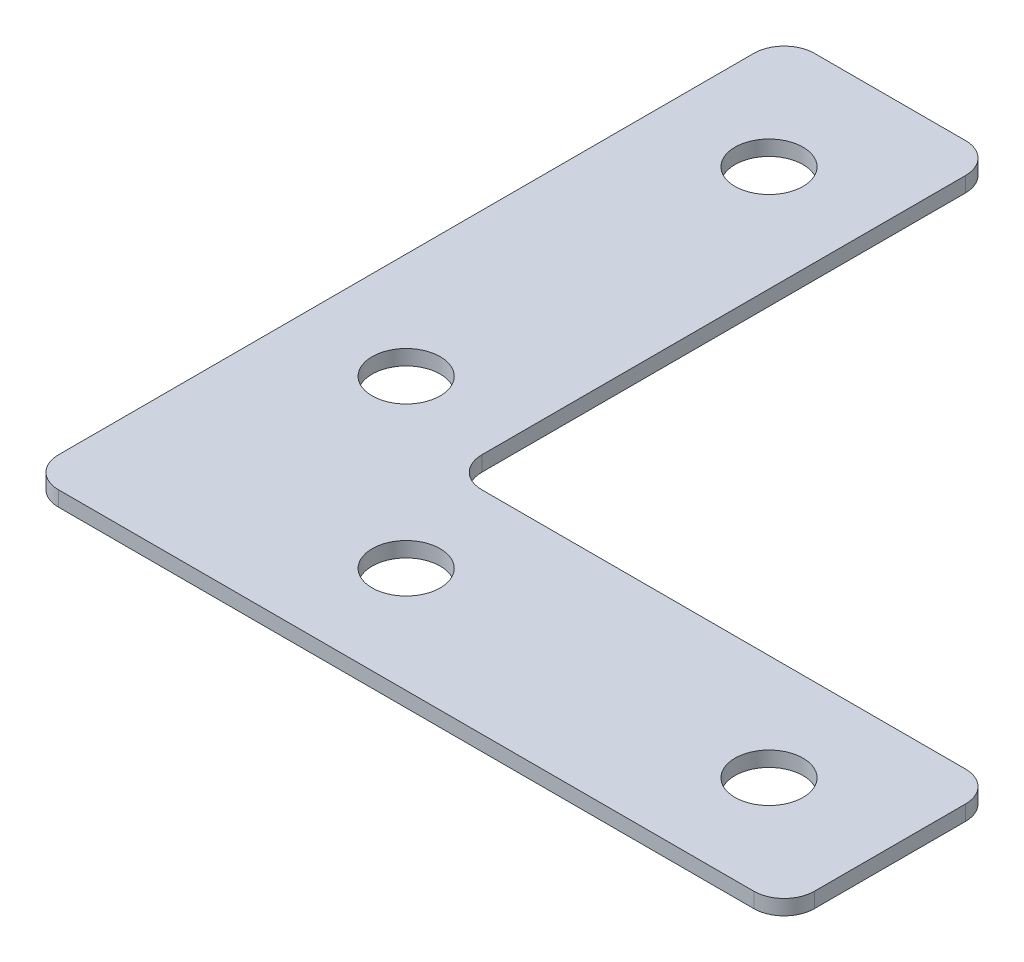
ISO-10303-21;
HEADER;
FILE_DESCRIPTION(('STEP AP214'),'2;1');
FILE_NAME('part.step','',(''),(''),'','','');
FILE_SCHEMA(('AUTOMOTIVE_DESIGN { 1 0 10303 214 1 1 1 1 }'));
ENDSEC;
DATA;
#1=APPLICATION_CONTEXT('core data for automotive mechanical design processes');
#2=APPLICATION_PROTOCOL_DEFINITION('international standard','automotive_design',2000,#1);
#3=PRODUCT_CONTEXT('',#1,'mechanical');
#4=PRODUCT('Part','Part','',(#3));
#5=PRODUCT_RELATED_PRODUCT_CATEGORY('part','',(#4));
#6=PRODUCT_DEFINITION_FORMATION('','',#4);
#7=PRODUCT_DEFINITION_CONTEXT('part definition',#1,'design');
#8=PRODUCT_DEFINITION('design','',#6,#7);
#9=PRODUCT_DEFINITION_SHAPE('','',#8);
#10=(LENGTH_UNIT() NAMED_UNIT(*) SI_UNIT(.MILLI.,.METRE.));
#11=(NAMED_UNIT(*) PLANE_ANGLE_UNIT() SI_UNIT($,.RADIAN.));
#12=(NAMED_UNIT(*) SI_UNIT($,.STERADIAN.) SOLID_ANGLE_UNIT());
#13=UNCERTAINTY_MEASURE_WITH_UNIT(LENGTH_MEASURE(1.E-05),#10,'distance_accuracy_value','');
#14=(GEOMETRIC_REPRESENTATION_CONTEXT(3) GLOBAL_UNCERTAINTY_ASSIGNED_CONTEXT((#13)) GLOBAL_UNIT_ASSIGNED_CONTEXT((#10,
#11,#12)) REPRESENTATION_CONTEXT('',''));
#15=CARTESIAN_POINT('',(0.,0.,0.));
#16=DIRECTION('',(0.,0.,1.));
#17=DIRECTION('',(1.,0.,0.));
#18=AXIS2_PLACEMENT_3D('',#15,#16,#17);
#19=CARTESIAN_POINT('',(2.,1.,-48.));
#20=DIRECTION('',(0.,-1.,0.));
#21=DIRECTION('',(0.,0.,-1.));
#22=AXIS2_PLACEMENT_3D('',#19,#20,#21);
#23=PLANE('',#22);
#24=CARTESIAN_POINT('',(2.,1.,-48.));
#25=DIRECTION('',(0.,1.,0.));
#26=DIRECTION('',(0.,0.,-1.));
#27=AXIS2_PLACEMENT_3D('',#24,#25,#26);
#28=CIRCLE('',#27,2.);
#29=CARTESIAN_POINT('',(2.00000000000001,1.,-50.));
#30=VERTEX_POINT('',#29);
#31=CARTESIAN_POINT('',(0.,1.,-48.));
#32=VERTEX_POINT('',#31);
#33=EDGE_CURVE('E200',#30,#32,#28,.T.);
#34=ORIENTED_EDGE('',*,*,#33,.T.);
#35=DIRECTION('',(0.,0.,1.));
#36=VECTOR('',#35,1.);
#37=CARTESIAN_POINT('',(0.,1.,-2.00000000000001));
#38=LINE('',#37,#36);
#39=CARTESIAN_POINT('',(0.,1.,-2.00000000000001));
#40=VERTEX_POINT('',#39);
#41=EDGE_CURVE('E112',#32,#40,#38,.T.);
#42=ORIENTED_EDGE('',*,*,#41,.T.);
#43=CARTESIAN_POINT('',(2.,1.,-2.));
#44=DIRECTION('',(0.,1.,0.));
#45=DIRECTION('',(0.,0.,-1.));
#46=AXIS2_PLACEMENT_3D('',#43,#44,#45);
#47=CIRCLE('',#46,2.);
#48=CARTESIAN_POINT('',(2.00000000000001,1.,0.));
#49=VERTEX_POINT('',#48);
#50=EDGE_CURVE('E237',#40,#49,#47,.T.);
#51=ORIENTED_EDGE('',*,*,#50,.T.);
#52=DIRECTION('',(1.,0.,0.));
#53=VECTOR('',#52,1.);
#54=CARTESIAN_POINT('',(2.00000000000001,1.,0.));
#55=LINE('',#54,#53);
#56=CARTESIAN_POINT('',(48.,1.,0.));
#57=VERTEX_POINT('',#56);
#58=EDGE_CURVE('E257',#49,#57,#55,.T.);
#59=ORIENTED_EDGE('',*,*,#58,.T.);
#60=CARTESIAN_POINT('',(48.,1.,-2.));
#61=DIRECTION('',(0.,1.,0.));
#62=DIRECTION('',(0.,0.,1.));
#63=AXIS2_PLACEMENT_3D('',#60,#61,#62);
#64=CIRCLE('',#63,2.);
#65=CARTESIAN_POINT('',(50.,1.,-2.00000000000001));
#66=VERTEX_POINT('',#65);
#67=EDGE_CURVE('E253',#57,#66,#64,.T.);
#68=ORIENTED_EDGE('',*,*,#67,.T.);
#69=DIRECTION('',(0.,0.,-1.));
#70=VECTOR('',#69,1.);
#71=CARTESIAN_POINT('',(50.,1.,-12.));
#72=LINE('',#71,#70);
#73=CARTESIAN_POINT('',(50.,1.,-12.));
#74=VERTEX_POINT('',#73);
#75=EDGE_CURVE('E256',#66,#74,#72,.T.);
#76=ORIENTED_EDGE('',*,*,#75,.T.);
#77=CARTESIAN_POINT('',(48.,1.,-12.));
#78=DIRECTION('',(0.,1.,0.));
#79=DIRECTION('',(0.,0.,-1.));
#80=AXIS2_PLACEMENT_3D('',#77,#78,#79);
#81=CIRCLE('',#80,2.);
#82=CARTESIAN_POINT('',(48.,1.,-14.));
#83=VERTEX_POINT('',#82);
#84=EDGE_CURVE('E261',#74,#83,#81,.T.);
#85=ORIENTED_EDGE('',*,*,#84,.T.);
#86=DIRECTION('',(-1.,0.,0.));
#87=VECTOR('',#86,1.);
#88=CARTESIAN_POINT('',(16.,1.,-14.));
#89=LINE('',#88,#87);
#90=CARTESIAN_POINT('',(16.,1.,-14.));
#91=VERTEX_POINT('',#90);
#92=EDGE_CURVE('E268',#83,#91,#89,.T.);
#93=ORIENTED_EDGE('',*,*,#92,.T.);
#94=CARTESIAN_POINT('',(16.,1.,-16.));
#95=DIRECTION('',(0.,-1.,0.));
#96=DIRECTION('',(0.,0.,1.));
#97=AXIS2_PLACEMENT_3D('',#94,#95,#96);
#98=CIRCLE('',#97,2.);
#99=CARTESIAN_POINT('',(14.,1.,-16.));
#100=VERTEX_POINT('',#99);
#101=EDGE_CURVE('E143',#91,#100,#98,.T.);
#102=ORIENTED_EDGE('',*,*,#101,.T.);
#103=DIRECTION('',(0.,0.,-1.));
#104=VECTOR('',#103,1.);
#105=CARTESIAN_POINT('',(14.,1.,-48.));
#106=LINE('',#105,#104);
#107=CARTESIAN_POINT('',(14.,1.,-48.));
#108=VERTEX_POINT('',#107);
#109=EDGE_CURVE('E137',#100,#108,#106,.T.);
#110=ORIENTED_EDGE('',*,*,#109,.T.);
#111=CARTESIAN_POINT('',(12.,1.,-48.));
#112=DIRECTION('',(0.,1.,0.));
#113=DIRECTION('',(0.,0.,-1.));
#114=AXIS2_PLACEMENT_3D('',#111,#112,#113);
#115=CIRCLE('',#114,2.);
#116=CARTESIAN_POINT('',(12.,1.,-50.));
#117=VERTEX_POINT('',#116);
#118=EDGE_CURVE('E141',#108,#117,#115,.T.);
#119=ORIENTED_EDGE('',*,*,#118,.T.);
#120=DIRECTION('',(-1.,0.,0.));
#121=VECTOR('',#120,1.);
#122=CARTESIAN_POINT('',(2.00000000000001,1.,-50.));
#123=LINE('',#122,#121);
#124=EDGE_CURVE('E57',#117,#30,#123,.T.);
#125=ORIENTED_EDGE('',*,*,#124,.T.);
#126=EDGE_LOOP('',(#34,#42,#51,#59,#68,#76,#85,#93,#102,#110,#119,#125));
#127=FACE_BOUND('',#126,.T.);
#128=CARTESIAN_POINT('',(18.,1.,-7.));
#129=DIRECTION('',(0.,1.,0.));
#130=DIRECTION('',(0.,0.,1.));
#131=AXIS2_PLACEMENT_3D('',#128,#129,#130);
#132=CIRCLE('',#131,2.25);
#133=CARTESIAN_POINT('',(18.,1.,-4.75));
#134=VERTEX_POINT('',#133);
#135=EDGE_CURVE('E170',#134,#134,#132,.T.);
#136=ORIENTED_EDGE('',*,*,#135,.F.);
#137=EDGE_LOOP('',(#136));
#138=FACE_BOUND('',#137,.T.);
#139=CARTESIAN_POINT('',(42.,1.,-7.));
#140=DIRECTION('',(0.,1.,0.));
#141=DIRECTION('',(0.,0.,1.));
#142=AXIS2_PLACEMENT_3D('',#139,#140,#141);
#143=CIRCLE('',#142,2.25);
#144=CARTESIAN_POINT('',(42.,1.,-4.75));
#145=VERTEX_POINT('',#144);
#146=EDGE_CURVE('E338',#145,#145,#143,.T.);
#147=ORIENTED_EDGE('',*,*,#146,.F.);
#148=EDGE_LOOP('',(#147));
#149=FACE_BOUND('',#148,.T.);
#150=CARTESIAN_POINT('',(7.,1.,-42.));
#151=DIRECTION('',(0.,1.,0.));
#152=DIRECTION('',(0.,0.,1.));
#153=AXIS2_PLACEMENT_3D('',#150,#151,#152);
#154=CIRCLE('',#153,2.25);
#155=CARTESIAN_POINT('',(7.,1.,-39.75));
#156=VERTEX_POINT('',#155);
#157=EDGE_CURVE('E330',#156,#156,#154,.T.);
#158=ORIENTED_EDGE('',*,*,#157,.F.);
#159=EDGE_LOOP('',(#158));
#160=FACE_BOUND('',#159,.T.);
#161=CARTESIAN_POINT('',(7.,1.,-18.));
#162=DIRECTION('',(0.,1.,0.));
#163=DIRECTION('',(0.,0.,1.));
#164=AXIS2_PLACEMENT_3D('',#161,#162,#163);
#165=CIRCLE('',#164,2.25);
#166=CARTESIAN_POINT('',(7.,1.,-15.75));
#167=VERTEX_POINT('',#166);
#168=EDGE_CURVE('E319',#167,#167,#165,.T.);
#169=ORIENTED_EDGE('',*,*,#168,.F.);
#170=EDGE_LOOP('',(#169));
#171=FACE_BOUND('',#170,.T.);
#172=ADVANCED_FACE('F39',(#127,#138,#149,#160,#171),#23,.F.);
#173=CARTESIAN_POINT('',(2.,0.,-48.));
#174=DIRECTION('',(0.,-1.,0.));
#175=DIRECTION('',(0.,0.,-1.));
#176=AXIS2_PLACEMENT_3D('',#173,#174,#175);
#177=PLANE('',#176);
#178=CARTESIAN_POINT('',(7.,0.,-42.));
#179=DIRECTION('',(0.,1.,0.));
#180=DIRECTION('',(0.,0.,1.));
#181=AXIS2_PLACEMENT_3D('',#178,#179,#180);
#182=CIRCLE('',#181,2.25);
#183=CARTESIAN_POINT('',(7.,0.,-39.75));
#184=VERTEX_POINT('',#183);
#185=EDGE_CURVE('E327',#184,#184,#182,.T.);
#186=ORIENTED_EDGE('',*,*,#185,.T.);
#187=EDGE_LOOP('',(#186));
#188=FACE_BOUND('',#187,.T.);
#189=CARTESIAN_POINT('',(18.,0.,-7.));
#190=DIRECTION('',(0.,1.,0.));
#191=DIRECTION('',(0.,0.,1.));
#192=AXIS2_PLACEMENT_3D('',#189,#190,#191);
#193=CIRCLE('',#192,2.25);
#194=CARTESIAN_POINT('',(18.,0.,-4.75));
#195=VERTEX_POINT('',#194);
#196=EDGE_CURVE('E342',#195,#195,#193,.T.);
#197=ORIENTED_EDGE('',*,*,#196,.T.);
#198=EDGE_LOOP('',(#197));
#199=FACE_BOUND('',#198,.T.);
#200=CARTESIAN_POINT('',(2.,0.,-48.));
#201=DIRECTION('',(0.,1.,0.));
#202=DIRECTION('',(0.,0.,-1.));
#203=AXIS2_PLACEMENT_3D('',#200,#201,#202);
#204=CIRCLE('',#203,2.);
#205=CARTESIAN_POINT('',(2.00000000000001,0.,-50.));
#206=VERTEX_POINT('',#205);
#207=CARTESIAN_POINT('',(0.,0.,-48.));
#208=VERTEX_POINT('',#207);
#209=EDGE_CURVE('E165',#206,#208,#204,.T.);
#210=ORIENTED_EDGE('',*,*,#209,.F.);
#211=DIRECTION('',(-1.,0.,0.));
#212=VECTOR('',#211,1.);
#213=CARTESIAN_POINT('',(2.00000000000001,0.,-50.));
#214=LINE('',#213,#212);
#215=CARTESIAN_POINT('',(12.,0.,-50.));
#216=VERTEX_POINT('',#215);
#217=EDGE_CURVE('E104',#216,#206,#214,.T.);
#218=ORIENTED_EDGE('',*,*,#217,.F.);
#219=CARTESIAN_POINT('',(12.,0.,-48.));
#220=DIRECTION('',(0.,1.,0.));
#221=DIRECTION('',(0.,0.,-1.));
#222=AXIS2_PLACEMENT_3D('',#219,#220,#221);
#223=CIRCLE('',#222,2.);
#224=CARTESIAN_POINT('',(14.,0.,-48.));
#225=VERTEX_POINT('',#224);
#226=EDGE_CURVE('E98',#225,#216,#223,.T.);
#227=ORIENTED_EDGE('',*,*,#226,.F.);
#228=DIRECTION('',(0.,0.,-1.));
#229=VECTOR('',#228,1.);
#230=CARTESIAN_POINT('',(14.,0.,-48.));
#231=LINE('',#230,#229);
#232=CARTESIAN_POINT('',(14.,0.,-16.));
#233=VERTEX_POINT('',#232);
#234=EDGE_CURVE('E152',#233,#225,#231,.T.);
#235=ORIENTED_EDGE('',*,*,#234,.F.);
#236=CARTESIAN_POINT('',(16.,0.,-16.));
#237=DIRECTION('',(0.,-1.,0.));
#238=DIRECTION('',(0.,0.,1.));
#239=AXIS2_PLACEMENT_3D('',#236,#237,#238);
#240=CIRCLE('',#239,2.);
#241=CARTESIAN_POINT('',(16.,0.,-14.));
#242=VERTEX_POINT('',#241);
#243=EDGE_CURVE('E191',#242,#233,#240,.T.);
#244=ORIENTED_EDGE('',*,*,#243,.F.);
#245=DIRECTION('',(-1.,0.,0.));
#246=VECTOR('',#245,1.);
#247=CARTESIAN_POINT('',(16.,0.,-14.));
#248=LINE('',#247,#246);
#249=CARTESIAN_POINT('',(48.,0.,-14.));
#250=VERTEX_POINT('',#249);
#251=EDGE_CURVE('E188',#250,#242,#248,.T.);
#252=ORIENTED_EDGE('',*,*,#251,.F.);
#253=CARTESIAN_POINT('',(48.,0.,-12.));
#254=DIRECTION('',(0.,1.,0.));
#255=DIRECTION('',(0.,0.,-1.));
#256=AXIS2_PLACEMENT_3D('',#253,#254,#255);
#257=CIRCLE('',#256,2.);
#258=CARTESIAN_POINT('',(50.,0.,-12.));
#259=VERTEX_POINT('',#258);
#260=EDGE_CURVE('E185',#259,#250,#257,.T.);
#261=ORIENTED_EDGE('',*,*,#260,.F.);
#262=DIRECTION('',(0.,0.,-1.));
#263=VECTOR('',#262,1.);
#264=CARTESIAN_POINT('',(50.,0.,-12.));
#265=LINE('',#264,#263);
#266=CARTESIAN_POINT('',(50.,0.,-2.00000000000001));
#267=VERTEX_POINT('',#266);
#268=EDGE_CURVE('E182',#267,#259,#265,.T.);
#269=ORIENTED_EDGE('',*,*,#268,.F.);
#270=CARTESIAN_POINT('',(48.,0.,-2.));
#271=DIRECTION('',(0.,1.,0.));
#272=DIRECTION('',(0.,0.,1.));
#273=AXIS2_PLACEMENT_3D('',#270,#271,#272);
#274=CIRCLE('',#273,2.);
#275=CARTESIAN_POINT('',(48.,0.,0.));
#276=VERTEX_POINT('',#275);
#277=EDGE_CURVE('E179',#276,#267,#274,.T.);
#278=ORIENTED_EDGE('',*,*,#277,.F.);
#279=DIRECTION('',(1.,0.,0.));
#280=VECTOR('',#279,1.);
#281=CARTESIAN_POINT('',(2.00000000000001,0.,0.));
#282=LINE('',#281,#280);
#283=CARTESIAN_POINT('',(2.00000000000001,0.,0.));
#284=VERTEX_POINT('',#283);
#285=EDGE_CURVE('E176',#284,#276,#282,.T.);
#286=ORIENTED_EDGE('',*,*,#285,.F.);
#287=CARTESIAN_POINT('',(2.,0.,-2.));
#288=DIRECTION('',(0.,1.,0.));
#289=DIRECTION('',(0.,0.,-1.));
#290=AXIS2_PLACEMENT_3D('',#287,#288,#289);
#291=CIRCLE('',#290,2.);
#292=CARTESIAN_POINT('',(0.,0.,-2.00000000000001));
#293=VERTEX_POINT('',#292);
#294=EDGE_CURVE('E173',#293,#284,#291,.T.);
#295=ORIENTED_EDGE('',*,*,#294,.F.);
#296=DIRECTION('',(0.,0.,1.));
#297=VECTOR('',#296,1.);
#298=CARTESIAN_POINT('',(0.,0.,-2.00000000000001));
#299=LINE('',#298,#297);
#300=EDGE_CURVE('E169',#208,#293,#299,.T.);
#301=ORIENTED_EDGE('',*,*,#300,.F.);
#302=EDGE_LOOP('',(#210,#218,#227,#235,#244,#252,#261,#269,#278,#286,#295,#301));
#303=FACE_BOUND('',#302,.T.);
#304=CARTESIAN_POINT('',(42.,0.,-7.));
#305=DIRECTION('',(0.,1.,0.));
#306=DIRECTION('',(0.,0.,1.));
#307=AXIS2_PLACEMENT_3D('',#304,#305,#306);
#308=CIRCLE('',#307,2.25);
#309=CARTESIAN_POINT('',(42.,0.,-4.75));
#310=VERTEX_POINT('',#309);
#311=EDGE_CURVE('E334',#310,#310,#308,.T.);
#312=ORIENTED_EDGE('',*,*,#311,.T.);
#313=EDGE_LOOP('',(#312));
#314=FACE_BOUND('',#313,.T.);
#315=CARTESIAN_POINT('',(7.,0.,-18.));
#316=DIRECTION('',(0.,1.,0.));
#317=DIRECTION('',(0.,0.,1.));
#318=AXIS2_PLACEMENT_3D('',#315,#316,#317);
#319=CIRCLE('',#318,2.25);
#320=CARTESIAN_POINT('',(7.,0.,-15.75));
#321=VERTEX_POINT('',#320);
#322=EDGE_CURVE('E322',#321,#321,#319,.T.);
#323=ORIENTED_EDGE('',*,*,#322,.T.);
#324=EDGE_LOOP('',(#323));
#325=FACE_BOUND('',#324,.T.);
#326=ADVANCED_FACE('F241',(#188,#199,#303,#314,#325),#177,.T.);
#327=CARTESIAN_POINT('',(2.,1.,-48.));
#328=DIRECTION('',(0.,-1.,0.));
#329=DIRECTION('',(0.,0.,-1.));
#330=AXIS2_PLACEMENT_3D('',#327,#328,#329);
#331=CYLINDRICAL_SURFACE('',#330,2.);
#332=ORIENTED_EDGE('',*,*,#209,.T.);
#333=DIRECTION('',(0.,-1.,0.));
#334=VECTOR('',#333,1.);
#335=CARTESIAN_POINT('',(0.,1.,-48.));
#336=LINE('',#335,#334);
#337=EDGE_CURVE('E11',#32,#208,#336,.T.);
#338=ORIENTED_EDGE('',*,*,#337,.F.);
#339=ORIENTED_EDGE('',*,*,#33,.F.);
#340=DIRECTION('',(0.,-1.,0.));
#341=VECTOR('',#340,1.);
#342=CARTESIAN_POINT('',(2.00000000000001,1.,-50.));
#343=LINE('',#342,#341);
#344=EDGE_CURVE('E161',#30,#206,#343,.T.);
#345=ORIENTED_EDGE('',*,*,#344,.T.);
#346=EDGE_LOOP('',(#332,#338,#339,#345));
#347=FACE_BOUND('',#346,.T.);
#348=ADVANCED_FACE('F41',(#347),#331,.T.);
#349=CARTESIAN_POINT('',(0.,1.,-2.00000000000001));
#350=DIRECTION('',(1.,0.,0.));
#351=DIRECTION('',(0.,0.,-1.));
#352=AXIS2_PLACEMENT_3D('',#349,#350,#351);
#353=PLANE('',#352);
#354=ORIENTED_EDGE('',*,*,#300,.T.);
#355=DIRECTION('',(0.,-1.,0.));
#356=VECTOR('',#355,1.);
#357=CARTESIAN_POINT('',(0.,1.,-2.00000000000001));
#358=LINE('',#357,#356);
#359=EDGE_CURVE('E49',#40,#293,#358,.T.);
#360=ORIENTED_EDGE('',*,*,#359,.F.);
#361=ORIENTED_EDGE('',*,*,#41,.F.);
#362=ORIENTED_EDGE('',*,*,#337,.T.);
#363=EDGE_LOOP('',(#354,#360,#361,#362));
#364=FACE_BOUND('',#363,.T.);
#365=ADVANCED_FACE('F460',(#364),#353,.F.);
#366=CARTESIAN_POINT('',(2.,1.,-2.));
#367=DIRECTION('',(0.,-1.,0.));
#368=DIRECTION('',(0.,0.,-1.));
#369=AXIS2_PLACEMENT_3D('',#366,#367,#368);
#370=CYLINDRICAL_SURFACE('',#369,2.);
#371=ORIENTED_EDGE('',*,*,#294,.T.);
#372=DIRECTION('',(0.,-1.,0.));
#373=VECTOR('',#372,1.);
#374=CARTESIAN_POINT('',(2.00000000000001,1.,0.));
#375=LINE('',#374,#373);
#376=EDGE_CURVE('E227',#49,#284,#375,.T.);
#377=ORIENTED_EDGE('',*,*,#376,.F.);
#378=ORIENTED_EDGE('',*,*,#50,.F.);
#379=ORIENTED_EDGE('',*,*,#359,.T.);
#380=EDGE_LOOP('',(#371,#377,#378,#379));
#381=FACE_BOUND('',#380,.T.);
#382=ADVANCED_FACE('F235',(#381),#370,.T.);
#383=CARTESIAN_POINT('',(2.00000000000001,1.,0.));
#384=DIRECTION('',(0.,0.,-1.));
#385=DIRECTION('',(-1.,0.,0.));
#386=AXIS2_PLACEMENT_3D('',#383,#384,#385);
#387=PLANE('',#386);
#388=ORIENTED_EDGE('',*,*,#285,.T.);
#389=DIRECTION('',(0.,-1.,0.));
#390=VECTOR('',#389,1.);
#391=CARTESIAN_POINT('',(48.,1.,0.));
#392=LINE('',#391,#390);
#393=EDGE_CURVE('E223',#57,#276,#392,.T.);
#394=ORIENTED_EDGE('',*,*,#393,.F.);
#395=ORIENTED_EDGE('',*,*,#58,.F.);
#396=ORIENTED_EDGE('',*,*,#376,.T.);
#397=EDGE_LOOP('',(#388,#394,#395,#396));
#398=FACE_BOUND('',#397,.T.);
#399=ADVANCED_FACE('F247',(#398),#387,.F.);
#400=CARTESIAN_POINT('',(48.,1.,-2.));
#401=DIRECTION('',(0.,-1.,0.));
#402=DIRECTION('',(0.,0.,-1.));
#403=AXIS2_PLACEMENT_3D('',#400,#401,#402);
#404=CYLINDRICAL_SURFACE('',#403,2.);
#405=ORIENTED_EDGE('',*,*,#277,.T.);
#406=DIRECTION('',(0.,-1.,0.));
#407=VECTOR('',#406,1.);
#408=CARTESIAN_POINT('',(50.,1.,-2.00000000000001));
#409=LINE('',#408,#407);
#410=EDGE_CURVE('E219',#66,#267,#409,.T.);
#411=ORIENTED_EDGE('',*,*,#410,.F.);
#412=ORIENTED_EDGE('',*,*,#67,.F.);
#413=ORIENTED_EDGE('',*,*,#393,.T.);
#414=EDGE_LOOP('',(#405,#411,#412,#413));
#415=FACE_BOUND('',#414,.T.);
#416=ADVANCED_FACE('F251',(#415),#404,.T.);
#417=CARTESIAN_POINT('',(50.,1.,-12.));
#418=DIRECTION('',(-1.,0.,0.));
#419=DIRECTION('',(0.,0.,1.));
#420=AXIS2_PLACEMENT_3D('',#417,#418,#419);
#421=PLANE('',#420);
#422=ORIENTED_EDGE('',*,*,#268,.T.);
#423=DIRECTION('',(0.,-1.,0.));
#424=VECTOR('',#423,1.);
#425=CARTESIAN_POINT('',(50.,1.,-12.));
#426=LINE('',#425,#424);
#427=EDGE_CURVE('E215',#74,#259,#426,.T.);
#428=ORIENTED_EDGE('',*,*,#427,.F.);
#429=ORIENTED_EDGE('',*,*,#75,.F.);
#430=ORIENTED_EDGE('',*,*,#410,.T.);
#431=EDGE_LOOP('',(#422,#428,#429,#430));
#432=FACE_BOUND('',#431,.T.);
#433=ADVANCED_FACE('F425',(#432),#421,.F.);
#434=CARTESIAN_POINT('',(48.,1.,-12.));
#435=DIRECTION('',(0.,-1.,0.));
#436=DIRECTION('',(0.,0.,-1.));
#437=AXIS2_PLACEMENT_3D('',#434,#435,#436);
#438=CYLINDRICAL_SURFACE('',#437,2.);
#439=ORIENTED_EDGE('',*,*,#260,.T.);
#440=DIRECTION('',(0.,-1.,0.));
#441=VECTOR('',#440,1.);
#442=CARTESIAN_POINT('',(48.,1.,-14.));
#443=LINE('',#442,#441);
#444=EDGE_CURVE('E211',#83,#250,#443,.T.);
#445=ORIENTED_EDGE('',*,*,#444,.F.);
#446=ORIENTED_EDGE('',*,*,#84,.F.);
#447=ORIENTED_EDGE('',*,*,#427,.T.);
#448=EDGE_LOOP('',(#439,#445,#446,#447));
#449=FACE_BOUND('',#448,.T.);
#450=ADVANCED_FACE('F416',(#449),#438,.T.);
#451=CARTESIAN_POINT('',(16.,1.,-14.));
#452=DIRECTION('',(0.,0.,1.));
#453=DIRECTION('',(1.,0.,0.));
#454=AXIS2_PLACEMENT_3D('',#451,#452,#453);
#455=PLANE('',#454);
#456=ORIENTED_EDGE('',*,*,#251,.T.);
#457=DIRECTION('',(0.,-1.,0.));
#458=VECTOR('',#457,1.);
#459=CARTESIAN_POINT('',(16.,1.,-14.));
#460=LINE('',#459,#458);
#461=EDGE_CURVE('E207',#91,#242,#460,.T.);
#462=ORIENTED_EDGE('',*,*,#461,.F.);
#463=ORIENTED_EDGE('',*,*,#92,.F.);
#464=ORIENTED_EDGE('',*,*,#444,.T.);
#465=EDGE_LOOP('',(#456,#462,#463,#464));
#466=FACE_BOUND('',#465,.T.);
#467=ADVANCED_FACE('F276',(#466),#455,.F.);
#468=CARTESIAN_POINT('',(16.,1.,-16.));
#469=DIRECTION('',(0.,-1.,0.));
#470=DIRECTION('',(0.,0.,-1.));
#471=AXIS2_PLACEMENT_3D('',#468,#469,#470);
#472=CYLINDRICAL_SURFACE('',#471,2.);
#473=ORIENTED_EDGE('',*,*,#243,.T.);
#474=DIRECTION('',(0.,-1.,0.));
#475=VECTOR('',#474,1.);
#476=CARTESIAN_POINT('',(14.,1.,-16.));
#477=LINE('',#476,#475);
#478=EDGE_CURVE('E154',#100,#233,#477,.T.);
#479=ORIENTED_EDGE('',*,*,#478,.F.);
#480=ORIENTED_EDGE('',*,*,#101,.F.);
#481=ORIENTED_EDGE('',*,*,#461,.T.);
#482=EDGE_LOOP('',(#473,#479,#480,#481));
#483=FACE_BOUND('',#482,.T.);
#484=ADVANCED_FACE('F280',(#483),#472,.F.);
#485=CARTESIAN_POINT('',(14.,1.,-48.));
#486=DIRECTION('',(-1.,0.,0.));
#487=DIRECTION('',(0.,0.,1.));
#488=AXIS2_PLACEMENT_3D('',#485,#486,#487);
#489=PLANE('',#488);
#490=ORIENTED_EDGE('',*,*,#234,.T.);
#491=DIRECTION('',(0.,-1.,0.));
#492=VECTOR('',#491,1.);
#493=CARTESIAN_POINT('',(14.,1.,-48.));
#494=LINE('',#493,#492);
#495=EDGE_CURVE('E149',#108,#225,#494,.T.);
#496=ORIENTED_EDGE('',*,*,#495,.F.);
#497=ORIENTED_EDGE('',*,*,#109,.F.);
#498=ORIENTED_EDGE('',*,*,#478,.T.);
#499=EDGE_LOOP('',(#490,#496,#497,#498));
#500=FACE_BOUND('',#499,.T.);
#501=ADVANCED_FACE('F150',(#500),#489,.F.);
#502=CARTESIAN_POINT('',(12.,1.,-48.));
#503=DIRECTION('',(0.,-1.,0.));
#504=DIRECTION('',(0.,0.,-1.));
#505=AXIS2_PLACEMENT_3D('',#502,#503,#504);
#506=CYLINDRICAL_SURFACE('',#505,2.);
#507=ORIENTED_EDGE('',*,*,#226,.T.);
#508=DIRECTION('',(0.,-1.,0.));
#509=VECTOR('',#508,1.);
#510=CARTESIAN_POINT('',(12.,1.,-50.));
#511=LINE('',#510,#509);
#512=EDGE_CURVE('E155',#117,#216,#511,.T.);
#513=ORIENTED_EDGE('',*,*,#512,.F.);
#514=ORIENTED_EDGE('',*,*,#118,.F.);
#515=ORIENTED_EDGE('',*,*,#495,.T.);
#516=EDGE_LOOP('',(#507,#513,#514,#515));
#517=FACE_BOUND('',#516,.T.);
#518=ADVANCED_FACE('F157',(#517),#506,.T.);
#519=CARTESIAN_POINT('',(2.00000000000001,1.,-50.));
#520=DIRECTION('',(0.,0.,1.));
#521=DIRECTION('',(1.,0.,0.));
#522=AXIS2_PLACEMENT_3D('',#519,#520,#521);
#523=PLANE('',#522);
#524=ORIENTED_EDGE('',*,*,#217,.T.);
#525=ORIENTED_EDGE('',*,*,#344,.F.);
#526=ORIENTED_EDGE('',*,*,#124,.F.);
#527=ORIENTED_EDGE('',*,*,#512,.T.);
#528=EDGE_LOOP('',(#524,#525,#526,#527));
#529=FACE_BOUND('',#528,.T.);
#530=ADVANCED_FACE('F284',(#529),#523,.F.);
#531=CARTESIAN_POINT('',(18.,1.,-7.));
#532=DIRECTION('',(0.,-1.,0.));
#533=DIRECTION('',(0.,0.,-1.));
#534=AXIS2_PLACEMENT_3D('',#531,#532,#533);
#535=CYLINDRICAL_SURFACE('',#534,2.25);
#536=ORIENTED_EDGE('',*,*,#135,.T.);
#537=EDGE_LOOP('',(#536));
#538=FACE_BOUND('',#537,.T.);
#539=ORIENTED_EDGE('',*,*,#196,.F.);
#540=EDGE_LOOP('',(#539));
#541=FACE_BOUND('',#540,.T.);
#542=ADVANCED_FACE('F286',(#538,#541),#535,.F.);
#543=CARTESIAN_POINT('',(42.,1.,-7.));
#544=DIRECTION('',(0.,-1.,0.));
#545=DIRECTION('',(0.,0.,-1.));
#546=AXIS2_PLACEMENT_3D('',#543,#544,#545);
#547=CYLINDRICAL_SURFACE('',#546,2.25);
#548=ORIENTED_EDGE('',*,*,#146,.T.);
#549=EDGE_LOOP('',(#548));
#550=FACE_BOUND('',#549,.T.);
#551=ORIENTED_EDGE('',*,*,#311,.F.);
#552=EDGE_LOOP('',(#551));
#553=FACE_BOUND('',#552,.T.);
#554=ADVANCED_FACE('F292',(#550,#553),#547,.F.);
#555=CARTESIAN_POINT('',(7.,1.,-42.));
#556=DIRECTION('',(0.,-1.,0.));
#557=DIRECTION('',(0.,0.,-1.));
#558=AXIS2_PLACEMENT_3D('',#555,#556,#557);
#559=CYLINDRICAL_SURFACE('',#558,2.25);
#560=ORIENTED_EDGE('',*,*,#157,.T.);
#561=EDGE_LOOP('',(#560));
#562=FACE_BOUND('',#561,.T.);
#563=ORIENTED_EDGE('',*,*,#185,.F.);
#564=EDGE_LOOP('',(#563));
#565=FACE_BOUND('',#564,.T.);
#566=ADVANCED_FACE('F306',(#562,#565),#559,.F.);
#567=CARTESIAN_POINT('',(7.,1.,-18.));
#568=DIRECTION('',(0.,-1.,0.));
#569=DIRECTION('',(0.,0.,-1.));
#570=AXIS2_PLACEMENT_3D('',#567,#568,#569);
#571=CYLINDRICAL_SURFACE('',#570,2.25);
#572=ORIENTED_EDGE('',*,*,#168,.T.);
#573=EDGE_LOOP('',(#572));
#574=FACE_BOUND('',#573,.T.);
#575=ORIENTED_EDGE('',*,*,#322,.F.);
#576=EDGE_LOOP('',(#575));
#577=FACE_BOUND('',#576,.T.);
#578=ADVANCED_FACE('F310',(#574,#577),#571,.F.);
#579=CLOSED_SHELL('',(#172,#326,#348,#365,#382,#399,#416,#433,#450,#467,#484,#501,#518,#530,
#542,#554,#566,#578));
#580=MANIFOLD_SOLID_BREP('B2',#579);
#581=ADVANCED_BREP_SHAPE_REPRESENTATION('',(#18,#580),#14);
#582=SHAPE_DEFINITION_REPRESENTATION(#9,#581);
ENDSEC;
END-ISO-10303-21;
